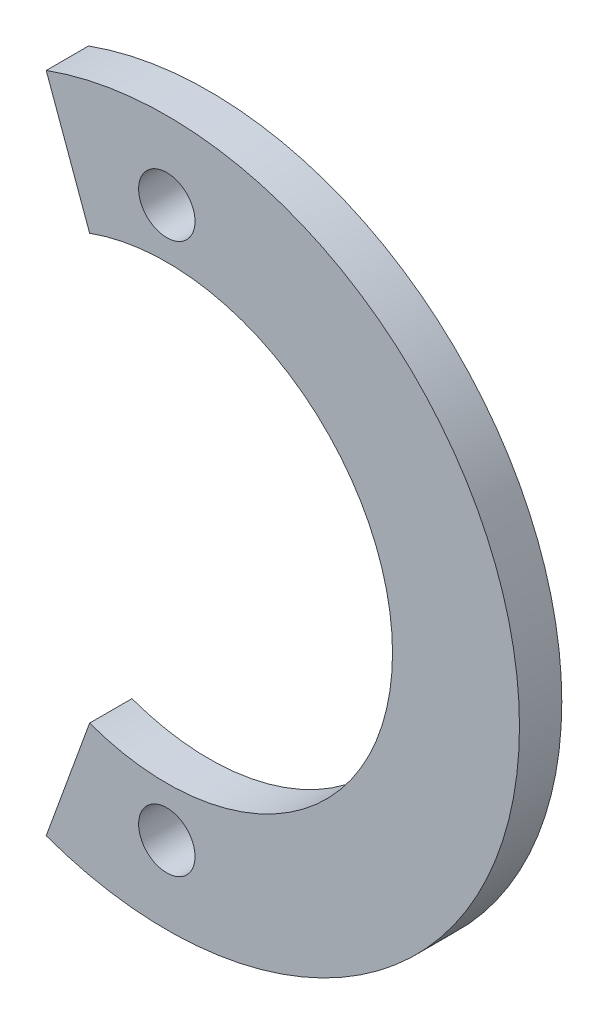
ISO-10303-21;
HEADER;
FILE_DESCRIPTION(('STEP AP214'),'2;1');
FILE_NAME('part.step','',(''),(''),'','','');
FILE_SCHEMA(('AUTOMOTIVE_DESIGN { 1 0 10303 214 1 1 1 1 }'));
ENDSEC;
DATA;
#1=APPLICATION_CONTEXT('core data for automotive mechanical design processes');
#2=APPLICATION_PROTOCOL_DEFINITION('international standard','automotive_design',2000,#1);
#3=PRODUCT_CONTEXT('',#1,'mechanical');
#4=PRODUCT('Part','Part','',(#3));
#5=PRODUCT_RELATED_PRODUCT_CATEGORY('part','',(#4));
#6=PRODUCT_DEFINITION_FORMATION('','',#4);
#7=PRODUCT_DEFINITION_CONTEXT('part definition',#1,'design');
#8=PRODUCT_DEFINITION('design','',#6,#7);
#9=PRODUCT_DEFINITION_SHAPE('','',#8);
#10=(LENGTH_UNIT() NAMED_UNIT(*) SI_UNIT(.MILLI.,.METRE.));
#11=(NAMED_UNIT(*) PLANE_ANGLE_UNIT() SI_UNIT($,.RADIAN.));
#12=(NAMED_UNIT(*) SI_UNIT($,.STERADIAN.) SOLID_ANGLE_UNIT());
#13=UNCERTAINTY_MEASURE_WITH_UNIT(LENGTH_MEASURE(1.E-05),#10,'distance_accuracy_value','');
#14=(GEOMETRIC_REPRESENTATION_CONTEXT(3) GLOBAL_UNCERTAINTY_ASSIGNED_CONTEXT((#13)) GLOBAL_UNIT_ASSIGNED_CONTEXT((#10,
#11,#12)) REPRESENTATION_CONTEXT('',''));
#15=CARTESIAN_POINT('',(0.,0.,0.));
#16=DIRECTION('',(0.,0.,1.));
#17=DIRECTION('',(1.,0.,0.));
#18=AXIS2_PLACEMENT_3D('',#15,#16,#17);
#19=CARTESIAN_POINT('',(0.,0.,3.));
#20=DIRECTION('',(0.,0.,-1.));
#21=DIRECTION('',(-1.,0.,0.));
#22=AXIS2_PLACEMENT_3D('',#19,#20,#21);
#23=CYLINDRICAL_SURFACE('',#22,16.);
#24=CARTESIAN_POINT('',(0.,0.,0.));
#25=DIRECTION('',(0.,0.,1.));
#26=DIRECTION('',(1.,0.,0.));
#27=AXIS2_PLACEMENT_3D('',#24,#25,#26);
#28=CIRCLE('',#27,16.);
#29=CARTESIAN_POINT('',(-5.47232229321065,-15.0350819325746,0.));
#30=VERTEX_POINT('',#29);
#31=CARTESIAN_POINT('',(-5.47232229321066,15.0350819325745,0.));
#32=VERTEX_POINT('',#31);
#33=EDGE_CURVE('E98',#30,#32,#28,.T.);
#34=ORIENTED_EDGE('',*,*,#33,.F.);
#35=DIRECTION('',(0.,0.,-1.));
#36=VECTOR('',#35,1.);
#37=CARTESIAN_POINT('',(-5.47232229321065,-15.0350819325746,3.));
#38=LINE('',#37,#36);
#39=CARTESIAN_POINT('',(-5.47232229321065,-15.0350819325746,3.));
#40=VERTEX_POINT('',#39);
#41=EDGE_CURVE('E11',#40,#30,#38,.T.);
#42=ORIENTED_EDGE('',*,*,#41,.F.);
#43=CARTESIAN_POINT('',(0.,0.,3.));
#44=DIRECTION('',(0.,0.,1.));
#45=DIRECTION('',(1.,0.,0.));
#46=AXIS2_PLACEMENT_3D('',#43,#44,#45);
#47=CIRCLE('',#46,16.);
#48=CARTESIAN_POINT('',(-5.47232229321066,15.0350819325745,3.));
#49=VERTEX_POINT('',#48);
#50=EDGE_CURVE('E83',#40,#49,#47,.T.);
#51=ORIENTED_EDGE('',*,*,#50,.T.);
#52=DIRECTION('',(0.,0.,-1.));
#53=VECTOR('',#52,1.);
#54=CARTESIAN_POINT('',(-5.47232229321066,15.0350819325745,3.));
#55=LINE('',#54,#53);
#56=EDGE_CURVE('E51',#49,#32,#55,.T.);
#57=ORIENTED_EDGE('',*,*,#56,.T.);
#58=EDGE_LOOP('',(#34,#42,#51,#57));
#59=FACE_BOUND('',#58,.T.);
#60=ADVANCED_FACE('F35',(#59),#23,.F.);
#61=CARTESIAN_POINT('',(0.,0.,3.));
#62=DIRECTION('',(0.93969262078591,-0.342020143325665,0.));
#63=DIRECTION('',(0.342020143325665,0.93969262078591,0.));
#64=AXIS2_PLACEMENT_3D('',#61,#62,#63);
#65=PLANE('',#64);
#66=DIRECTION('',(-0.342020143325666,-0.93969262078591,0.));
#67=VECTOR('',#66,1.);
#68=CARTESIAN_POINT('',(0.,0.,0.));
#69=LINE('',#68,#67);
#70=CARTESIAN_POINT('',(-8.55050358314164,-23.4923155196477,0.));
#71=VERTEX_POINT('',#70);
#72=EDGE_CURVE('E89',#30,#71,#69,.T.);
#73=ORIENTED_EDGE('',*,*,#72,.T.);
#74=DIRECTION('',(0.,0.,-1.));
#75=VECTOR('',#74,1.);
#76=CARTESIAN_POINT('',(-8.55050358314164,-23.4923155196477,3.));
#77=LINE('',#76,#75);
#78=CARTESIAN_POINT('',(-8.55050358314164,-23.4923155196477,3.));
#79=VERTEX_POINT('',#78);
#80=EDGE_CURVE('E43',#79,#71,#77,.T.);
#81=ORIENTED_EDGE('',*,*,#80,.F.);
#82=DIRECTION('',(-0.342020143325666,-0.93969262078591,0.));
#83=VECTOR('',#82,1.);
#84=CARTESIAN_POINT('',(0.,0.,3.));
#85=LINE('',#84,#83);
#86=EDGE_CURVE('E77',#40,#79,#85,.T.);
#87=ORIENTED_EDGE('',*,*,#86,.F.);
#88=ORIENTED_EDGE('',*,*,#41,.T.);
#89=EDGE_LOOP('',(#73,#81,#87,#88));
#90=FACE_BOUND('',#89,.T.);
#91=ADVANCED_FACE('F87',(#90),#65,.F.);
#92=CARTESIAN_POINT('',(0.,0.,3.));
#93=DIRECTION('',(0.,0.,-1.));
#94=DIRECTION('',(-1.,0.,0.));
#95=AXIS2_PLACEMENT_3D('',#92,#93,#94);
#96=CYLINDRICAL_SURFACE('',#95,25.);
#97=CARTESIAN_POINT('',(0.,0.,0.));
#98=DIRECTION('',(0.,0.,1.));
#99=DIRECTION('',(1.,0.,0.));
#100=AXIS2_PLACEMENT_3D('',#97,#98,#99);
#101=CIRCLE('',#100,25.);
#102=CARTESIAN_POINT('',(-8.55050358314165,23.4923155196477,0.));
#103=VERTEX_POINT('',#102);
#104=EDGE_CURVE('E102',#71,#103,#101,.T.);
#105=ORIENTED_EDGE('',*,*,#104,.T.);
#106=DIRECTION('',(0.,0.,-1.));
#107=VECTOR('',#106,1.);
#108=CARTESIAN_POINT('',(-8.55050358314165,23.4923155196477,3.));
#109=LINE('',#108,#107);
#110=CARTESIAN_POINT('',(-8.55050358314165,23.4923155196477,3.));
#111=VERTEX_POINT('',#110);
#112=EDGE_CURVE('E65',#111,#103,#109,.T.);
#113=ORIENTED_EDGE('',*,*,#112,.F.);
#114=CARTESIAN_POINT('',(0.,0.,3.));
#115=DIRECTION('',(0.,0.,1.));
#116=DIRECTION('',(1.,0.,0.));
#117=AXIS2_PLACEMENT_3D('',#114,#115,#116);
#118=CIRCLE('',#117,25.);
#119=EDGE_CURVE('E82',#79,#111,#118,.T.);
#120=ORIENTED_EDGE('',*,*,#119,.F.);
#121=ORIENTED_EDGE('',*,*,#80,.T.);
#122=EDGE_LOOP('',(#105,#113,#120,#121));
#123=FACE_BOUND('',#122,.T.);
#124=ADVANCED_FACE('F92',(#123),#96,.T.);
#125=CARTESIAN_POINT('',(0.,0.,3.));
#126=DIRECTION('',(-0.939692620785909,-0.342020143325666,0.));
#127=DIRECTION('',(0.342020143325666,-0.939692620785909,0.));
#128=AXIS2_PLACEMENT_3D('',#125,#126,#127);
#129=PLANE('',#128);
#130=DIRECTION('',(-0.342020143325666,0.939692620785909,0.));
#131=VECTOR('',#130,1.);
#132=CARTESIAN_POINT('',(0.,0.,0.));
#133=LINE('',#132,#131);
#134=EDGE_CURVE('E104',#32,#103,#133,.T.);
#135=ORIENTED_EDGE('',*,*,#134,.F.);
#136=ORIENTED_EDGE('',*,*,#56,.F.);
#137=DIRECTION('',(-0.342020143325666,0.939692620785909,0.));
#138=VECTOR('',#137,1.);
#139=CARTESIAN_POINT('',(0.,0.,3.));
#140=LINE('',#139,#138);
#141=EDGE_CURVE('E93',#49,#111,#140,.T.);
#142=ORIENTED_EDGE('',*,*,#141,.T.);
#143=ORIENTED_EDGE('',*,*,#112,.T.);
#144=EDGE_LOOP('',(#135,#136,#142,#143));
#145=FACE_BOUND('',#144,.T.);
#146=ADVANCED_FACE('F136',(#145),#129,.T.);
#147=CARTESIAN_POINT('',(0.,0.,3.));
#148=DIRECTION('',(0.,0.,1.));
#149=DIRECTION('',(1.,0.,0.));
#150=AXIS2_PLACEMENT_3D('',#147,#148,#149);
#151=PLANE('',#150);
#152=CARTESIAN_POINT('',(0.,-19.5,3.));
#153=DIRECTION('',(0.,0.,-1.));
#154=DIRECTION('',(-1.,0.,0.));
#155=AXIS2_PLACEMENT_3D('',#152,#153,#154);
#156=CIRCLE('',#155,2.00000000000001);
#157=CARTESIAN_POINT('',(-2.00000000000001,-19.5,3.));
#158=VERTEX_POINT('',#157);
#159=EDGE_CURVE('E100',#158,#158,#156,.T.);
#160=ORIENTED_EDGE('',*,*,#159,.T.);
#161=EDGE_LOOP('',(#160));
#162=FACE_BOUND('',#161,.T.);
#163=CARTESIAN_POINT('',(0.,19.5,3.));
#164=DIRECTION('',(0.,0.,-1.));
#165=DIRECTION('',(1.,0.,0.));
#166=AXIS2_PLACEMENT_3D('',#163,#164,#165);
#167=CIRCLE('',#166,2.00000000000001);
#168=CARTESIAN_POINT('',(2.,19.5,3.));
#169=VERTEX_POINT('',#168);
#170=EDGE_CURVE('E113',#169,#169,#167,.T.);
#171=ORIENTED_EDGE('',*,*,#170,.T.);
#172=EDGE_LOOP('',(#171));
#173=FACE_BOUND('',#172,.T.);
#174=ORIENTED_EDGE('',*,*,#50,.F.);
#175=ORIENTED_EDGE('',*,*,#86,.T.);
#176=ORIENTED_EDGE('',*,*,#119,.T.);
#177=ORIENTED_EDGE('',*,*,#141,.F.);
#178=EDGE_LOOP('',(#174,#175,#176,#177));
#179=FACE_BOUND('',#178,.T.);
#180=ADVANCED_FACE('F79',(#162,#173,#179),#151,.T.);
#181=CARTESIAN_POINT('',(0.,0.,0.));
#182=DIRECTION('',(0.,0.,1.));
#183=DIRECTION('',(1.,0.,0.));
#184=AXIS2_PLACEMENT_3D('',#181,#182,#183);
#185=PLANE('',#184);
#186=CARTESIAN_POINT('',(0.,-19.5,0.));
#187=DIRECTION('',(0.,0.,-1.));
#188=DIRECTION('',(-1.,0.,0.));
#189=AXIS2_PLACEMENT_3D('',#186,#187,#188);
#190=CIRCLE('',#189,2.00000000000001);
#191=CARTESIAN_POINT('',(-2.00000000000001,-19.5,0.));
#192=VERTEX_POINT('',#191);
#193=EDGE_CURVE('E116',#192,#192,#190,.T.);
#194=ORIENTED_EDGE('',*,*,#193,.F.);
#195=EDGE_LOOP('',(#194));
#196=FACE_BOUND('',#195,.T.);
#197=CARTESIAN_POINT('',(0.,19.5,0.));
#198=DIRECTION('',(0.,0.,-1.));
#199=DIRECTION('',(1.,0.,0.));
#200=AXIS2_PLACEMENT_3D('',#197,#198,#199);
#201=CIRCLE('',#200,2.00000000000001);
#202=CARTESIAN_POINT('',(2.,19.5,0.));
#203=VERTEX_POINT('',#202);
#204=EDGE_CURVE('E110',#203,#203,#201,.T.);
#205=ORIENTED_EDGE('',*,*,#204,.F.);
#206=EDGE_LOOP('',(#205));
#207=FACE_BOUND('',#206,.T.);
#208=ORIENTED_EDGE('',*,*,#33,.T.);
#209=ORIENTED_EDGE('',*,*,#134,.T.);
#210=ORIENTED_EDGE('',*,*,#104,.F.);
#211=ORIENTED_EDGE('',*,*,#72,.F.);
#212=EDGE_LOOP('',(#208,#209,#210,#211));
#213=FACE_BOUND('',#212,.T.);
#214=ADVANCED_FACE('F131',(#196,#207,#213),#185,.F.);
#215=CARTESIAN_POINT('',(0.,19.5,3.));
#216=DIRECTION('',(0.,0.,-1.));
#217=DIRECTION('',(-1.,0.,0.));
#218=AXIS2_PLACEMENT_3D('',#215,#216,#217);
#219=CYLINDRICAL_SURFACE('',#218,2.00000000000001);
#220=ORIENTED_EDGE('',*,*,#170,.F.);
#221=EDGE_LOOP('',(#220));
#222=FACE_BOUND('',#221,.T.);
#223=ORIENTED_EDGE('',*,*,#204,.T.);
#224=EDGE_LOOP('',(#223));
#225=FACE_BOUND('',#224,.T.);
#226=ADVANCED_FACE('F127',(#222,#225),#219,.F.);
#227=CARTESIAN_POINT('',(0.,-19.5,3.));
#228=DIRECTION('',(0.,0.,-1.));
#229=DIRECTION('',(-1.,0.,0.));
#230=AXIS2_PLACEMENT_3D('',#227,#228,#229);
#231=CYLINDRICAL_SURFACE('',#230,2.00000000000001);
#232=ORIENTED_EDGE('',*,*,#159,.F.);
#233=EDGE_LOOP('',(#232));
#234=FACE_BOUND('',#233,.T.);
#235=ORIENTED_EDGE('',*,*,#193,.T.);
#236=EDGE_LOOP('',(#235));
#237=FACE_BOUND('',#236,.T.);
#238=ADVANCED_FACE('F124',(#234,#237),#231,.F.);
#239=CLOSED_SHELL('',(#60,#91,#124,#146,#180,#214,#226,#238));
#240=MANIFOLD_SOLID_BREP('B2',#239);
#241=ADVANCED_BREP_SHAPE_REPRESENTATION('',(#18,#240),#14);
#242=SHAPE_DEFINITION_REPRESENTATION(#9,#241);
ENDSEC;
END-ISO-10303-21;
